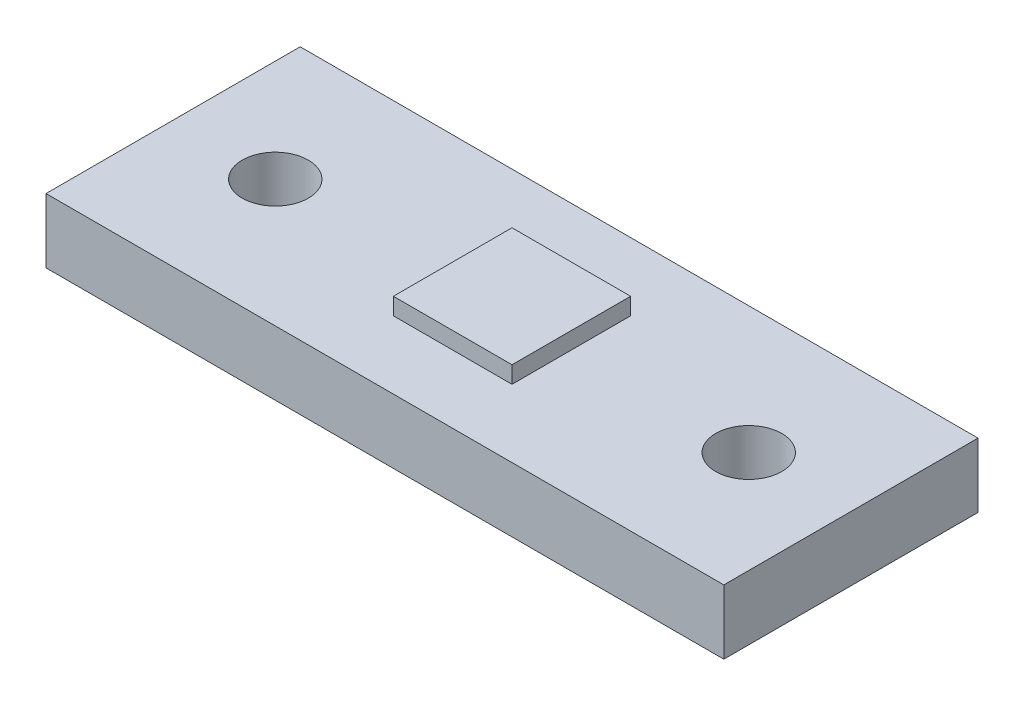
ISO-10303-21;
HEADER;
FILE_DESCRIPTION(('STEP AP214'),'2;1');
FILE_NAME('part.step','',(''),(''),'','','');
FILE_SCHEMA(('AUTOMOTIVE_DESIGN { 1 0 10303 214 1 1 1 1 }'));
ENDSEC;
DATA;
#1=APPLICATION_CONTEXT('core data for automotive mechanical design processes');
#2=APPLICATION_PROTOCOL_DEFINITION('international standard','automotive_design',2000,#1);
#3=PRODUCT_CONTEXT('',#1,'mechanical');
#4=PRODUCT('Part','Part','',(#3));
#5=PRODUCT_RELATED_PRODUCT_CATEGORY('part','',(#4));
#6=PRODUCT_DEFINITION_FORMATION('','',#4);
#7=PRODUCT_DEFINITION_CONTEXT('part definition',#1,'design');
#8=PRODUCT_DEFINITION('design','',#6,#7);
#9=PRODUCT_DEFINITION_SHAPE('','',#8);
#10=(LENGTH_UNIT() NAMED_UNIT(*) SI_UNIT(.MILLI.,.METRE.));
#11=(NAMED_UNIT(*) PLANE_ANGLE_UNIT() SI_UNIT($,.RADIAN.));
#12=(NAMED_UNIT(*) SI_UNIT($,.STERADIAN.) SOLID_ANGLE_UNIT());
#13=UNCERTAINTY_MEASURE_WITH_UNIT(LENGTH_MEASURE(1.E-05),#10,'distance_accuracy_value','');
#14=(GEOMETRIC_REPRESENTATION_CONTEXT(3) GLOBAL_UNCERTAINTY_ASSIGNED_CONTEXT((#13)) GLOBAL_UNIT_ASSIGNED_CONTEXT((#10,
#11,#12)) REPRESENTATION_CONTEXT('',''));
#15=CARTESIAN_POINT('',(0.,0.,0.));
#16=DIRECTION('',(0.,0.,1.));
#17=DIRECTION('',(1.,0.,0.));
#18=AXIS2_PLACEMENT_3D('',#15,#16,#17);
#19=CARTESIAN_POINT('',(0.,3.8,0.));
#20=DIRECTION('',(0.,-1.,0.));
#21=DIRECTION('',(0.,0.,-1.));
#22=AXIS2_PLACEMENT_3D('',#19,#20,#21);
#23=PLANE('',#22);
#24=CARTESIAN_POINT('',(33.97,3.8,-7.5));
#25=DIRECTION('',(0.,1.,0.));
#26=DIRECTION('',(0.,0.,1.));
#27=AXIS2_PLACEMENT_3D('',#24,#25,#26);
#28=CIRCLE('',#27,1.95);
#29=CARTESIAN_POINT('',(33.97,3.8,-9.45));
#30=VERTEX_POINT('',#29);
#31=EDGE_CURVE('E122',#30,#30,#28,.T.);
#32=ORIENTED_EDGE('',*,*,#31,.F.);
#33=EDGE_LOOP('',(#32));
#34=FACE_BOUND('',#33,.T.);
#35=DIRECTION('',(0.,0.,1.));
#36=VECTOR('',#35,1.);
#37=CARTESIAN_POINT('',(0.,3.8,0.));
#38=LINE('',#37,#36);
#39=CARTESIAN_POINT('',(0.,3.8,-15.));
#40=VERTEX_POINT('',#39);
#41=CARTESIAN_POINT('',(0.,3.8,0.));
#42=VERTEX_POINT('',#41);
#43=EDGE_CURVE('E137',#40,#42,#38,.T.);
#44=ORIENTED_EDGE('',*,*,#43,.T.);
#45=DIRECTION('',(1.,0.,0.));
#46=VECTOR('',#45,1.);
#47=CARTESIAN_POINT('',(0.,3.8,0.));
#48=LINE('',#47,#46);
#49=CARTESIAN_POINT('',(40.,3.8,0.));
#50=VERTEX_POINT('',#49);
#51=EDGE_CURVE('E140',#42,#50,#48,.T.);
#52=ORIENTED_EDGE('',*,*,#51,.T.);
#53=DIRECTION('',(0.,0.,-1.));
#54=VECTOR('',#53,1.);
#55=CARTESIAN_POINT('',(40.,3.8,0.));
#56=LINE('',#55,#54);
#57=CARTESIAN_POINT('',(40.,3.8,-15.));
#58=VERTEX_POINT('',#57);
#59=EDGE_CURVE('E143',#50,#58,#56,.T.);
#60=ORIENTED_EDGE('',*,*,#59,.T.);
#61=DIRECTION('',(-1.,0.,0.));
#62=VECTOR('',#61,1.);
#63=CARTESIAN_POINT('',(0.,3.8,-15.));
#64=LINE('',#63,#62);
#65=EDGE_CURVE('E145',#58,#40,#64,.T.);
#66=ORIENTED_EDGE('',*,*,#65,.T.);
#67=EDGE_LOOP('',(#44,#52,#60,#66));
#68=FACE_BOUND('',#67,.T.);
#69=CARTESIAN_POINT('',(6.03,3.8,-7.5));
#70=DIRECTION('',(0.,1.,0.));
#71=DIRECTION('',(0.,0.,1.));
#72=AXIS2_PLACEMENT_3D('',#69,#70,#71);
#73=CIRCLE('',#72,1.95);
#74=CARTESIAN_POINT('',(6.03,3.8,-9.45));
#75=VERTEX_POINT('',#74);
#76=EDGE_CURVE('E131',#75,#75,#73,.T.);
#77=ORIENTED_EDGE('',*,*,#76,.F.);
#78=EDGE_LOOP('',(#77));
#79=FACE_BOUND('',#78,.T.);
#80=DIRECTION('',(0.,0.,1.));
#81=VECTOR('',#80,1.);
#82=CARTESIAN_POINT('',(16.5,3.8,-11.));
#83=LINE('',#82,#81);
#84=CARTESIAN_POINT('',(16.5,3.8,-11.));
#85=VERTEX_POINT('',#84);
#86=CARTESIAN_POINT('',(16.5,3.8,-4.00000000000001));
#87=VERTEX_POINT('',#86);
#88=EDGE_CURVE('E118',#85,#87,#83,.T.);
#89=ORIENTED_EDGE('',*,*,#88,.F.);
#90=DIRECTION('',(-1.,0.,0.));
#91=VECTOR('',#90,1.);
#92=CARTESIAN_POINT('',(23.5,3.8,-11.));
#93=LINE('',#92,#91);
#94=CARTESIAN_POINT('',(23.5,3.8,-11.));
#95=VERTEX_POINT('',#94);
#96=EDGE_CURVE('E115',#95,#85,#93,.T.);
#97=ORIENTED_EDGE('',*,*,#96,.F.);
#98=DIRECTION('',(0.,0.,-1.));
#99=VECTOR('',#98,1.);
#100=CARTESIAN_POINT('',(23.5,3.8,-11.));
#101=LINE('',#100,#99);
#102=CARTESIAN_POINT('',(23.5,3.8,-4.00000000000001));
#103=VERTEX_POINT('',#102);
#104=EDGE_CURVE('E53',#103,#95,#101,.T.);
#105=ORIENTED_EDGE('',*,*,#104,.F.);
#106=DIRECTION('',(1.,0.,0.));
#107=VECTOR('',#106,1.);
#108=CARTESIAN_POINT('',(23.5,3.8,-4.00000000000001));
#109=LINE('',#108,#107);
#110=EDGE_CURVE('E48',#87,#103,#109,.T.);
#111=ORIENTED_EDGE('',*,*,#110,.F.);
#112=EDGE_LOOP('',(#89,#97,#105,#111));
#113=FACE_BOUND('',#112,.T.);
#114=ADVANCED_FACE('F33',(#34,#68,#79,#113),#23,.F.);
#115=CARTESIAN_POINT('',(0.,0.,0.));
#116=DIRECTION('',(0.,-1.,0.));
#117=DIRECTION('',(0.,0.,-1.));
#118=AXIS2_PLACEMENT_3D('',#115,#116,#117);
#119=PLANE('',#118);
#120=CARTESIAN_POINT('',(6.03,0.,-7.5));
#121=DIRECTION('',(0.,1.,0.));
#122=DIRECTION('',(0.,0.,1.));
#123=AXIS2_PLACEMENT_3D('',#120,#121,#122);
#124=CIRCLE('',#123,1.95);
#125=CARTESIAN_POINT('',(6.03,0.,-9.45));
#126=VERTEX_POINT('',#125);
#127=EDGE_CURVE('E129',#126,#126,#124,.T.);
#128=ORIENTED_EDGE('',*,*,#127,.T.);
#129=EDGE_LOOP('',(#128));
#130=FACE_BOUND('',#129,.T.);
#131=DIRECTION('',(0.,0.,1.));
#132=VECTOR('',#131,1.);
#133=CARTESIAN_POINT('',(0.,0.,0.));
#134=LINE('',#133,#132);
#135=CARTESIAN_POINT('',(0.,0.,-15.));
#136=VERTEX_POINT('',#135);
#137=CARTESIAN_POINT('',(0.,0.,0.));
#138=VERTEX_POINT('',#137);
#139=EDGE_CURVE('E134',#136,#138,#134,.T.);
#140=ORIENTED_EDGE('',*,*,#139,.F.);
#141=DIRECTION('',(-1.,0.,0.));
#142=VECTOR('',#141,1.);
#143=CARTESIAN_POINT('',(0.,0.,-15.));
#144=LINE('',#143,#142);
#145=CARTESIAN_POINT('',(40.,0.,-15.));
#146=VERTEX_POINT('',#145);
#147=EDGE_CURVE('E141',#146,#136,#144,.T.);
#148=ORIENTED_EDGE('',*,*,#147,.F.);
#149=DIRECTION('',(0.,0.,-1.));
#150=VECTOR('',#149,1.);
#151=CARTESIAN_POINT('',(40.,0.,0.));
#152=LINE('',#151,#150);
#153=CARTESIAN_POINT('',(40.,0.,0.));
#154=VERTEX_POINT('',#153);
#155=EDGE_CURVE('E152',#154,#146,#152,.T.);
#156=ORIENTED_EDGE('',*,*,#155,.F.);
#157=DIRECTION('',(1.,0.,0.));
#158=VECTOR('',#157,1.);
#159=CARTESIAN_POINT('',(0.,0.,0.));
#160=LINE('',#159,#158);
#161=EDGE_CURVE('E150',#138,#154,#160,.T.);
#162=ORIENTED_EDGE('',*,*,#161,.F.);
#163=EDGE_LOOP('',(#140,#148,#156,#162));
#164=FACE_BOUND('',#163,.T.);
#165=CARTESIAN_POINT('',(33.97,0.,-7.5));
#166=DIRECTION('',(0.,1.,0.));
#167=DIRECTION('',(0.,0.,1.));
#168=AXIS2_PLACEMENT_3D('',#165,#166,#167);
#169=CIRCLE('',#168,1.95);
#170=CARTESIAN_POINT('',(33.97,0.,-9.45));
#171=VERTEX_POINT('',#170);
#172=EDGE_CURVE('E119',#171,#171,#169,.T.);
#173=ORIENTED_EDGE('',*,*,#172,.T.);
#174=EDGE_LOOP('',(#173));
#175=FACE_BOUND('',#174,.T.);
#176=ADVANCED_FACE('F170',(#130,#164,#175),#119,.T.);
#177=CARTESIAN_POINT('',(0.,3.8,0.));
#178=DIRECTION('',(1.,0.,0.));
#179=DIRECTION('',(0.,0.,-1.));
#180=AXIS2_PLACEMENT_3D('',#177,#178,#179);
#181=PLANE('',#180);
#182=ORIENTED_EDGE('',*,*,#139,.T.);
#183=DIRECTION('',(0.,-1.,0.));
#184=VECTOR('',#183,1.);
#185=CARTESIAN_POINT('',(0.,3.8,0.));
#186=LINE('',#185,#184);
#187=EDGE_CURVE('E11',#42,#138,#186,.T.);
#188=ORIENTED_EDGE('',*,*,#187,.F.);
#189=ORIENTED_EDGE('',*,*,#43,.F.);
#190=DIRECTION('',(0.,-1.,0.));
#191=VECTOR('',#190,1.);
#192=CARTESIAN_POINT('',(0.,3.8,-15.));
#193=LINE('',#192,#191);
#194=EDGE_CURVE('E147',#40,#136,#193,.T.);
#195=ORIENTED_EDGE('',*,*,#194,.T.);
#196=EDGE_LOOP('',(#182,#188,#189,#195));
#197=FACE_BOUND('',#196,.T.);
#198=ADVANCED_FACE('F35',(#197),#181,.F.);
#199=CARTESIAN_POINT('',(0.,3.8,0.));
#200=DIRECTION('',(0.,0.,-1.));
#201=DIRECTION('',(-1.,0.,0.));
#202=AXIS2_PLACEMENT_3D('',#199,#200,#201);
#203=PLANE('',#202);
#204=ORIENTED_EDGE('',*,*,#161,.T.);
#205=DIRECTION('',(0.,-1.,0.));
#206=VECTOR('',#205,1.);
#207=CARTESIAN_POINT('',(40.,3.8,0.));
#208=LINE('',#207,#206);
#209=EDGE_CURVE('E41',#50,#154,#208,.T.);
#210=ORIENTED_EDGE('',*,*,#209,.F.);
#211=ORIENTED_EDGE('',*,*,#51,.F.);
#212=ORIENTED_EDGE('',*,*,#187,.T.);
#213=EDGE_LOOP('',(#204,#210,#211,#212));
#214=FACE_BOUND('',#213,.T.);
#215=ADVANCED_FACE('F181',(#214),#203,.F.);
#216=CARTESIAN_POINT('',(40.,3.8,0.));
#217=DIRECTION('',(-1.,0.,0.));
#218=DIRECTION('',(0.,0.,1.));
#219=AXIS2_PLACEMENT_3D('',#216,#217,#218);
#220=PLANE('',#219);
#221=ORIENTED_EDGE('',*,*,#155,.T.);
#222=DIRECTION('',(0.,-1.,0.));
#223=VECTOR('',#222,1.);
#224=CARTESIAN_POINT('',(40.,3.8,-15.));
#225=LINE('',#224,#223);
#226=EDGE_CURVE('E157',#58,#146,#225,.T.);
#227=ORIENTED_EDGE('',*,*,#226,.F.);
#228=ORIENTED_EDGE('',*,*,#59,.F.);
#229=ORIENTED_EDGE('',*,*,#209,.T.);
#230=EDGE_LOOP('',(#221,#227,#228,#229));
#231=FACE_BOUND('',#230,.T.);
#232=ADVANCED_FACE('F164',(#231),#220,.F.);
#233=CARTESIAN_POINT('',(0.,3.8,-15.));
#234=DIRECTION('',(0.,0.,1.));
#235=DIRECTION('',(1.,0.,0.));
#236=AXIS2_PLACEMENT_3D('',#233,#234,#235);
#237=PLANE('',#236);
#238=ORIENTED_EDGE('',*,*,#147,.T.);
#239=ORIENTED_EDGE('',*,*,#194,.F.);
#240=ORIENTED_EDGE('',*,*,#65,.F.);
#241=ORIENTED_EDGE('',*,*,#226,.T.);
#242=EDGE_LOOP('',(#238,#239,#240,#241));
#243=FACE_BOUND('',#242,.T.);
#244=ADVANCED_FACE('F174',(#243),#237,.F.);
#245=CARTESIAN_POINT('',(6.03,3.8,-7.5));
#246=DIRECTION('',(0.,-1.,0.));
#247=DIRECTION('',(0.,0.,-1.));
#248=AXIS2_PLACEMENT_3D('',#245,#246,#247);
#249=CYLINDRICAL_SURFACE('',#248,1.95);
#250=CARTESIAN_POINT('',(6.03,3.8,-9.45));
#251=CARTESIAN_POINT('',(6.03,3.76041666666667,-9.45));
#252=CARTESIAN_POINT('',(6.03,3.72083333333333,-9.45));
#253=CARTESIAN_POINT('',(6.03,3.64166666666667,-9.45));
#254=CARTESIAN_POINT('',(6.03,3.60208333333333,-9.45));
#255=CARTESIAN_POINT('',(6.03,3.52291666666667,-9.45));
#256=CARTESIAN_POINT('',(6.03,3.48333333333333,-9.45));
#257=CARTESIAN_POINT('',(6.03,3.40416666666667,-9.45));
#258=CARTESIAN_POINT('',(6.03,3.36458333333333,-9.45));
#259=CARTESIAN_POINT('',(6.03,3.28541666666667,-9.45));
#260=CARTESIAN_POINT('',(6.03,3.24583333333333,-9.45));
#261=CARTESIAN_POINT('',(6.03,3.16666666666667,-9.45));
#262=CARTESIAN_POINT('',(6.03,3.12708333333333,-9.45));
#263=CARTESIAN_POINT('',(6.03,3.04791666666667,-9.45));
#264=CARTESIAN_POINT('',(6.03,3.00833333333333,-9.45));
#265=CARTESIAN_POINT('',(6.03,2.92916666666667,-9.45));
#266=CARTESIAN_POINT('',(6.03,2.88958333333333,-9.45));
#267=CARTESIAN_POINT('',(6.03,2.81041666666667,-9.45));
#268=CARTESIAN_POINT('',(6.03,2.77083333333333,-9.45));
#269=CARTESIAN_POINT('',(6.03,2.69166666666667,-9.45));
#270=CARTESIAN_POINT('',(6.03,2.65208333333333,-9.45));
#271=CARTESIAN_POINT('',(6.03,2.57291666666667,-9.45));
#272=CARTESIAN_POINT('',(6.03,2.53333333333333,-9.45));
#273=CARTESIAN_POINT('',(6.03,2.45416666666667,-9.45));
#274=CARTESIAN_POINT('',(6.03,2.41458333333333,-9.45));
#275=CARTESIAN_POINT('',(6.03,2.33541666666667,-9.45));
#276=CARTESIAN_POINT('',(6.03,2.29583333333333,-9.45));
#277=CARTESIAN_POINT('',(6.03,2.21666666666667,-9.45));
#278=CARTESIAN_POINT('',(6.03,2.17708333333333,-9.45));
#279=CARTESIAN_POINT('',(6.03,2.09791666666667,-9.45));
#280=CARTESIAN_POINT('',(6.03,2.05833333333333,-9.45));
#281=CARTESIAN_POINT('',(6.03,1.97916666666667,-9.45));
#282=CARTESIAN_POINT('',(6.03,1.93958333333333,-9.45));
#283=CARTESIAN_POINT('',(6.03,1.86041666666667,-9.45));
#284=CARTESIAN_POINT('',(6.03,1.82083333333333,-9.45));
#285=CARTESIAN_POINT('',(6.03,1.74166666666667,-9.45));
#286=CARTESIAN_POINT('',(6.03,1.70208333333333,-9.45));
#287=CARTESIAN_POINT('',(6.03,1.62291666666667,-9.45));
#288=CARTESIAN_POINT('',(6.03,1.58333333333333,-9.45));
#289=CARTESIAN_POINT('',(6.03,1.50416666666667,-9.45));
#290=CARTESIAN_POINT('',(6.03,1.46458333333333,-9.45));
#291=CARTESIAN_POINT('',(6.03,1.38541666666667,-9.45));
#292=CARTESIAN_POINT('',(6.03,1.34583333333333,-9.45));
#293=CARTESIAN_POINT('',(6.03,1.26666666666667,-9.45));
#294=CARTESIAN_POINT('',(6.03,1.22708333333333,-9.45));
#295=CARTESIAN_POINT('',(6.03,1.14791666666667,-9.45));
#296=CARTESIAN_POINT('',(6.03,1.10833333333333,-9.45));
#297=CARTESIAN_POINT('',(6.03,1.02916666666667,-9.45));
#298=CARTESIAN_POINT('',(6.03,0.989583333333333,-9.45));
#299=CARTESIAN_POINT('',(6.03,0.910416666666667,-9.45));
#300=CARTESIAN_POINT('',(6.03,0.870833333333333,-9.45));
#301=CARTESIAN_POINT('',(6.03,0.791666666666667,-9.45));
#302=CARTESIAN_POINT('',(6.03,0.752083333333333,-9.45));
#303=CARTESIAN_POINT('',(6.03,0.672916666666667,-9.45));
#304=CARTESIAN_POINT('',(6.03,0.633333333333333,-9.45));
#305=CARTESIAN_POINT('',(6.03,0.554166666666667,-9.45));
#306=CARTESIAN_POINT('',(6.03,0.514583333333334,-9.45));
#307=CARTESIAN_POINT('',(6.03,0.435416666666667,-9.45));
#308=CARTESIAN_POINT('',(6.03,0.395833333333333,-9.45));
#309=CARTESIAN_POINT('',(6.03,0.316666666666666,-9.45));
#310=CARTESIAN_POINT('',(6.03,0.277083333333333,-9.45));
#311=CARTESIAN_POINT('',(6.03,0.197916666666667,-9.45));
#312=CARTESIAN_POINT('',(6.03,0.158333333333333,-9.45));
#313=CARTESIAN_POINT('',(6.03,0.0791666666666666,-9.45));
#314=CARTESIAN_POINT('',(6.03,0.0395833333333333,-9.45));
#315=CARTESIAN_POINT('',(6.03,0.,-9.45));
#316=B_SPLINE_CURVE_WITH_KNOTS('',3,(#250,#251,#252,#253,#254,#255,#256,#257,#258,#259,#260,
#261,#262,#263,#264,#265,#266,#267,#268,#269,#270,#271,#272,#273,#274,#275,#276,#277,#278,#279,
#280,#281,#282,#283,#284,#285,#286,#287,#288,#289,#290,#291,#292,#293,#294,#295,#296,#297,#298,
#299,#300,#301,#302,#303,#304,#305,#306,#307,#308,#309,#310,#311,#312,#313,#314,#315),
.UNSPECIFIED.,.F.,.F.,(4,2,2,2,2,2,2,2,2,2,2,2,2,2,2,2,2,2,2,2,2,2,2,2,2,2,2,2,2,2,2,2,4),(0.,
0.11875,0.2375,0.35625,0.475,0.59375,0.7125,0.831249999999999,0.95,1.06875,1.1875,1.30625,1.425,
1.54375,1.6625,1.78125,1.9,2.01875,2.1375,2.25625,2.375,2.49375,2.6125,2.73125,2.85,2.96875,
3.0875,3.20625,3.325,3.44375,3.5625,3.68125,3.8),.UNSPECIFIED.);
#317=EDGE_CURVE('BSEAM198',#75,#126,#316,.T.);
#318=ORIENTED_EDGE('',*,*,#76,.T.);
#319=ORIENTED_EDGE('',*,*,#127,.F.);
#320=ORIENTED_EDGE('',*,*,#317,.T.);
#321=ORIENTED_EDGE('',*,*,#317,.F.);
#322=EDGE_LOOP('',(#318,#320,#319,#321));
#323=FACE_BOUND('',#322,.T.);
#324=ADVANCED_FACE('F198',(#323),#249,.F.);
#325=CARTESIAN_POINT('',(33.97,3.8,-7.5));
#326=DIRECTION('',(0.,-1.,0.));
#327=DIRECTION('',(0.,0.,-1.));
#328=AXIS2_PLACEMENT_3D('',#325,#326,#327);
#329=CYLINDRICAL_SURFACE('',#328,1.95);
#330=CARTESIAN_POINT('',(33.97,3.8,-9.45));
#331=CARTESIAN_POINT('',(33.97,3.76041666666667,-9.45));
#332=CARTESIAN_POINT('',(33.97,3.72083333333333,-9.45));
#333=CARTESIAN_POINT('',(33.97,3.64166666666667,-9.45));
#334=CARTESIAN_POINT('',(33.97,3.60208333333333,-9.45));
#335=CARTESIAN_POINT('',(33.97,3.52291666666667,-9.45));
#336=CARTESIAN_POINT('',(33.97,3.48333333333333,-9.45));
#337=CARTESIAN_POINT('',(33.97,3.40416666666667,-9.45));
#338=CARTESIAN_POINT('',(33.97,3.36458333333333,-9.45));
#339=CARTESIAN_POINT('',(33.97,3.28541666666667,-9.45));
#340=CARTESIAN_POINT('',(33.97,3.24583333333333,-9.45));
#341=CARTESIAN_POINT('',(33.97,3.16666666666667,-9.45));
#342=CARTESIAN_POINT('',(33.97,3.12708333333333,-9.45));
#343=CARTESIAN_POINT('',(33.97,3.04791666666667,-9.45));
#344=CARTESIAN_POINT('',(33.97,3.00833333333333,-9.45));
#345=CARTESIAN_POINT('',(33.97,2.92916666666667,-9.45));
#346=CARTESIAN_POINT('',(33.97,2.88958333333333,-9.45));
#347=CARTESIAN_POINT('',(33.97,2.81041666666667,-9.45));
#348=CARTESIAN_POINT('',(33.97,2.77083333333333,-9.45));
#349=CARTESIAN_POINT('',(33.97,2.69166666666667,-9.45));
#350=CARTESIAN_POINT('',(33.97,2.65208333333333,-9.45));
#351=CARTESIAN_POINT('',(33.97,2.57291666666667,-9.45));
#352=CARTESIAN_POINT('',(33.97,2.53333333333333,-9.45));
#353=CARTESIAN_POINT('',(33.97,2.45416666666667,-9.45));
#354=CARTESIAN_POINT('',(33.97,2.41458333333333,-9.45));
#355=CARTESIAN_POINT('',(33.97,2.33541666666667,-9.45));
#356=CARTESIAN_POINT('',(33.97,2.29583333333333,-9.45));
#357=CARTESIAN_POINT('',(33.97,2.21666666666667,-9.45));
#358=CARTESIAN_POINT('',(33.97,2.17708333333333,-9.45));
#359=CARTESIAN_POINT('',(33.97,2.09791666666667,-9.45));
#360=CARTESIAN_POINT('',(33.97,2.05833333333333,-9.45));
#361=CARTESIAN_POINT('',(33.97,1.97916666666667,-9.45));
#362=CARTESIAN_POINT('',(33.97,1.93958333333333,-9.45));
#363=CARTESIAN_POINT('',(33.97,1.86041666666667,-9.45));
#364=CARTESIAN_POINT('',(33.97,1.82083333333333,-9.45));
#365=CARTESIAN_POINT('',(33.97,1.74166666666667,-9.45));
#366=CARTESIAN_POINT('',(33.97,1.70208333333333,-9.45));
#367=CARTESIAN_POINT('',(33.97,1.62291666666667,-9.45));
#368=CARTESIAN_POINT('',(33.97,1.58333333333333,-9.45));
#369=CARTESIAN_POINT('',(33.97,1.50416666666667,-9.45));
#370=CARTESIAN_POINT('',(33.97,1.46458333333333,-9.45));
#371=CARTESIAN_POINT('',(33.97,1.38541666666667,-9.45));
#372=CARTESIAN_POINT('',(33.97,1.34583333333333,-9.45));
#373=CARTESIAN_POINT('',(33.97,1.26666666666667,-9.45));
#374=CARTESIAN_POINT('',(33.97,1.22708333333333,-9.45));
#375=CARTESIAN_POINT('',(33.97,1.14791666666667,-9.45));
#376=CARTESIAN_POINT('',(33.97,1.10833333333333,-9.45));
#377=CARTESIAN_POINT('',(33.97,1.02916666666667,-9.45));
#378=CARTESIAN_POINT('',(33.97,0.989583333333333,-9.45));
#379=CARTESIAN_POINT('',(33.97,0.910416666666667,-9.45));
#380=CARTESIAN_POINT('',(33.97,0.870833333333333,-9.45));
#381=CARTESIAN_POINT('',(33.97,0.791666666666667,-9.45));
#382=CARTESIAN_POINT('',(33.97,0.752083333333333,-9.45));
#383=CARTESIAN_POINT('',(33.97,0.672916666666667,-9.45));
#384=CARTESIAN_POINT('',(33.97,0.633333333333333,-9.45));
#385=CARTESIAN_POINT('',(33.97,0.554166666666667,-9.45));
#386=CARTESIAN_POINT('',(33.97,0.514583333333334,-9.45));
#387=CARTESIAN_POINT('',(33.97,0.435416666666667,-9.45));
#388=CARTESIAN_POINT('',(33.97,0.395833333333333,-9.45));
#389=CARTESIAN_POINT('',(33.97,0.316666666666666,-9.45));
#390=CARTESIAN_POINT('',(33.97,0.277083333333333,-9.45));
#391=CARTESIAN_POINT('',(33.97,0.197916666666667,-9.45));
#392=CARTESIAN_POINT('',(33.97,0.158333333333333,-9.45));
#393=CARTESIAN_POINT('',(33.97,0.0791666666666666,-9.45));
#394=CARTESIAN_POINT('',(33.97,0.0395833333333333,-9.45));
#395=CARTESIAN_POINT('',(33.97,0.,-9.45));
#396=B_SPLINE_CURVE_WITH_KNOTS('',3,(#330,#331,#332,#333,#334,#335,#336,#337,#338,#339,#340,
#341,#342,#343,#344,#345,#346,#347,#348,#349,#350,#351,#352,#353,#354,#355,#356,#357,#358,#359,
#360,#361,#362,#363,#364,#365,#366,#367,#368,#369,#370,#371,#372,#373,#374,#375,#376,#377,#378,
#379,#380,#381,#382,#383,#384,#385,#386,#387,#388,#389,#390,#391,#392,#393,#394,#395),
.UNSPECIFIED.,.F.,.F.,(4,2,2,2,2,2,2,2,2,2,2,2,2,2,2,2,2,2,2,2,2,2,2,2,2,2,2,2,2,2,2,2,4),(0.,
0.11875,0.2375,0.35625,0.475,0.59375,0.7125,0.831249999999999,0.95,1.06875,1.1875,1.30625,1.425,
1.54375,1.6625,1.78125,1.9,2.01875,2.1375,2.25625,2.375,2.49375,2.6125,2.73125,2.85,2.96875,
3.0875,3.20625,3.325,3.44375,3.5625,3.68125,3.8),.UNSPECIFIED.);
#397=EDGE_CURVE('BSEAM205',#30,#171,#396,.T.);
#398=ORIENTED_EDGE('',*,*,#31,.T.);
#399=ORIENTED_EDGE('',*,*,#172,.F.);
#400=ORIENTED_EDGE('',*,*,#397,.T.);
#401=ORIENTED_EDGE('',*,*,#397,.F.);
#402=EDGE_LOOP('',(#398,#400,#399,#401));
#403=FACE_BOUND('',#402,.T.);
#404=ADVANCED_FACE('F205',(#403),#329,.F.);
#405=CARTESIAN_POINT('',(16.5,4.8,-11.));
#406=DIRECTION('',(1.,0.,0.));
#407=DIRECTION('',(0.,0.,-1.));
#408=AXIS2_PLACEMENT_3D('',#405,#406,#407);
#409=PLANE('',#408);
#410=ORIENTED_EDGE('',*,*,#88,.T.);
#411=DIRECTION('',(0.,-1.,0.));
#412=VECTOR('',#411,1.);
#413=CARTESIAN_POINT('',(16.5,4.8,-4.00000000000001));
#414=LINE('',#413,#412);
#415=CARTESIAN_POINT('',(16.5,4.8,-4.00000000000001));
#416=VERTEX_POINT('',#415);
#417=EDGE_CURVE('E99',#416,#87,#414,.T.);
#418=ORIENTED_EDGE('',*,*,#417,.F.);
#419=DIRECTION('',(0.,0.,1.));
#420=VECTOR('',#419,1.);
#421=CARTESIAN_POINT('',(16.5,4.8,-11.));
#422=LINE('',#421,#420);
#423=CARTESIAN_POINT('',(16.5,4.8,-11.));
#424=VERTEX_POINT('',#423);
#425=EDGE_CURVE('E106',#424,#416,#422,.T.);
#426=ORIENTED_EDGE('',*,*,#425,.F.);
#427=DIRECTION('',(0.,-1.,0.));
#428=VECTOR('',#427,1.);
#429=CARTESIAN_POINT('',(16.5,4.8,-11.));
#430=LINE('',#429,#428);
#431=EDGE_CURVE('E219',#424,#85,#430,.T.);
#432=ORIENTED_EDGE('',*,*,#431,.T.);
#433=EDGE_LOOP('',(#410,#418,#426,#432));
#434=FACE_BOUND('',#433,.T.);
#435=ADVANCED_FACE('F117',(#434),#409,.F.);
#436=CARTESIAN_POINT('',(23.5,4.8,-4.00000000000001));
#437=DIRECTION('',(0.,0.,-1.));
#438=DIRECTION('',(-1.,0.,0.));
#439=AXIS2_PLACEMENT_3D('',#436,#437,#438);
#440=PLANE('',#439);
#441=ORIENTED_EDGE('',*,*,#110,.T.);
#442=DIRECTION('',(0.,-1.,0.));
#443=VECTOR('',#442,1.);
#444=CARTESIAN_POINT('',(23.5,4.8,-4.00000000000001));
#445=LINE('',#444,#443);
#446=CARTESIAN_POINT('',(23.5,4.8,-4.00000000000001));
#447=VERTEX_POINT('',#446);
#448=EDGE_CURVE('E102',#447,#103,#445,.T.);
#449=ORIENTED_EDGE('',*,*,#448,.F.);
#450=DIRECTION('',(1.,0.,0.));
#451=VECTOR('',#450,1.);
#452=CARTESIAN_POINT('',(23.5,4.8,-4.00000000000001));
#453=LINE('',#452,#451);
#454=EDGE_CURVE('E95',#416,#447,#453,.T.);
#455=ORIENTED_EDGE('',*,*,#454,.F.);
#456=ORIENTED_EDGE('',*,*,#417,.T.);
#457=EDGE_LOOP('',(#441,#449,#455,#456));
#458=FACE_BOUND('',#457,.T.);
#459=ADVANCED_FACE('F97',(#458),#440,.F.);
#460=CARTESIAN_POINT('',(23.5,4.8,-11.));
#461=DIRECTION('',(-1.,0.,0.));
#462=DIRECTION('',(0.,0.,1.));
#463=AXIS2_PLACEMENT_3D('',#460,#461,#462);
#464=PLANE('',#463);
#465=ORIENTED_EDGE('',*,*,#104,.T.);
#466=DIRECTION('',(0.,-1.,0.));
#467=VECTOR('',#466,1.);
#468=CARTESIAN_POINT('',(23.5,4.8,-11.));
#469=LINE('',#468,#467);
#470=CARTESIAN_POINT('',(23.5,4.8,-11.));
#471=VERTEX_POINT('',#470);
#472=EDGE_CURVE('E124',#471,#95,#469,.T.);
#473=ORIENTED_EDGE('',*,*,#472,.F.);
#474=DIRECTION('',(0.,0.,-1.));
#475=VECTOR('',#474,1.);
#476=CARTESIAN_POINT('',(23.5,4.8,-11.));
#477=LINE('',#476,#475);
#478=EDGE_CURVE('E105',#447,#471,#477,.T.);
#479=ORIENTED_EDGE('',*,*,#478,.F.);
#480=ORIENTED_EDGE('',*,*,#448,.T.);
#481=EDGE_LOOP('',(#465,#473,#479,#480));
#482=FACE_BOUND('',#481,.T.);
#483=ADVANCED_FACE('F228',(#482),#464,.F.);
#484=CARTESIAN_POINT('',(23.5,4.8,-11.));
#485=DIRECTION('',(0.,0.,1.));
#486=DIRECTION('',(1.,0.,0.));
#487=AXIS2_PLACEMENT_3D('',#484,#485,#486);
#488=PLANE('',#487);
#489=ORIENTED_EDGE('',*,*,#96,.T.);
#490=ORIENTED_EDGE('',*,*,#431,.F.);
#491=DIRECTION('',(-1.,0.,0.));
#492=VECTOR('',#491,1.);
#493=CARTESIAN_POINT('',(23.5,4.8,-11.));
#494=LINE('',#493,#492);
#495=EDGE_CURVE('E111',#471,#424,#494,.T.);
#496=ORIENTED_EDGE('',*,*,#495,.F.);
#497=ORIENTED_EDGE('',*,*,#472,.T.);
#498=EDGE_LOOP('',(#489,#490,#496,#497));
#499=FACE_BOUND('',#498,.T.);
#500=ADVANCED_FACE('F218',(#499),#488,.F.);
#501=CARTESIAN_POINT('',(0.,4.8,0.));
#502=DIRECTION('',(0.,-1.,0.));
#503=DIRECTION('',(0.,0.,-1.));
#504=AXIS2_PLACEMENT_3D('',#501,#502,#503);
#505=PLANE('',#504);
#506=ORIENTED_EDGE('',*,*,#425,.T.);
#507=ORIENTED_EDGE('',*,*,#454,.T.);
#508=ORIENTED_EDGE('',*,*,#478,.T.);
#509=ORIENTED_EDGE('',*,*,#495,.T.);
#510=EDGE_LOOP('',(#506,#507,#508,#509));
#511=FACE_BOUND('',#510,.T.);
#512=ADVANCED_FACE('F109',(#511),#505,.F.);
#513=CLOSED_SHELL('',(#114,#176,#198,#215,#232,#244,#324,#404,#435,#459,#483,#500,#512));
#514=MANIFOLD_SOLID_BREP('B2',#513);
#515=ADVANCED_BREP_SHAPE_REPRESENTATION('',(#18,#514),#14);
#516=SHAPE_DEFINITION_REPRESENTATION(#9,#515);
ENDSEC;
END-ISO-10303-21;
